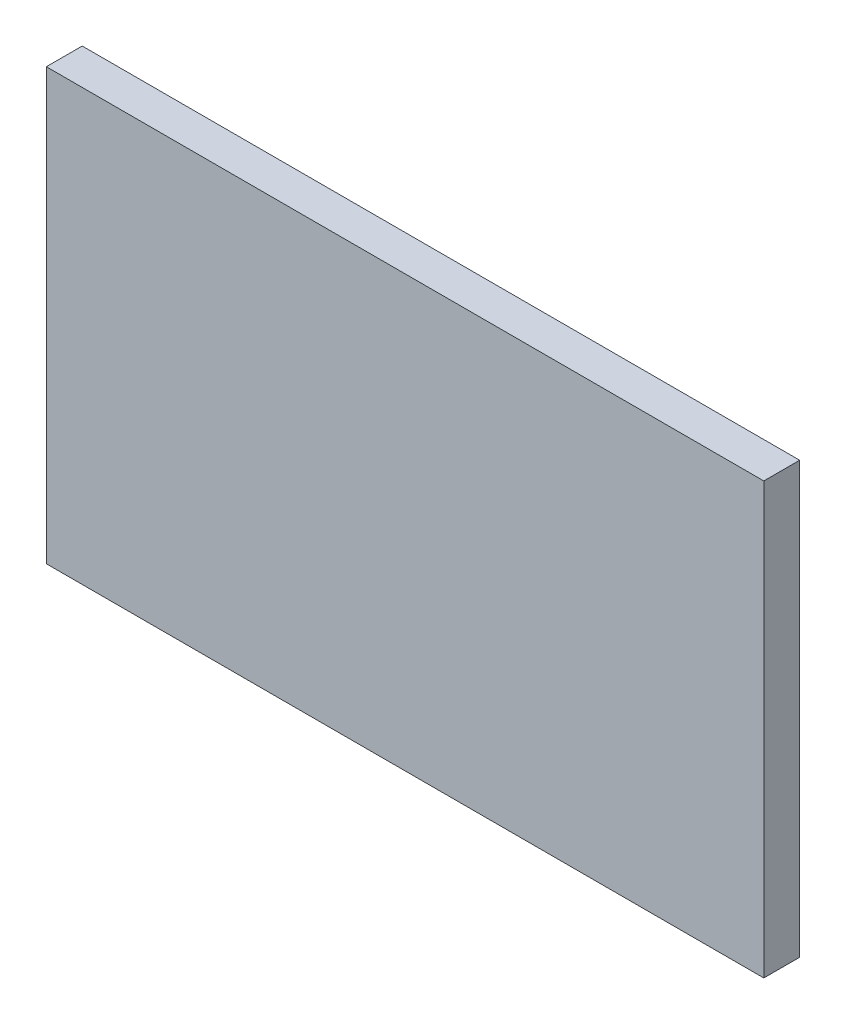
ISO-10303-21;
HEADER;
FILE_DESCRIPTION(('STEP AP214'),'2;1');
FILE_NAME('part.step','',(''),(''),'','','');
FILE_SCHEMA(('AUTOMOTIVE_DESIGN { 1 0 10303 214 1 1 1 1 }'));
ENDSEC;
DATA;
#1=APPLICATION_CONTEXT('core data for automotive mechanical design processes');
#2=APPLICATION_PROTOCOL_DEFINITION('international standard','automotive_design',2000,#1);
#3=PRODUCT_CONTEXT('',#1,'mechanical');
#4=PRODUCT('Part','Part','',(#3));
#5=PRODUCT_RELATED_PRODUCT_CATEGORY('part','',(#4));
#6=PRODUCT_DEFINITION_FORMATION('','',#4);
#7=PRODUCT_DEFINITION_CONTEXT('part definition',#1,'design');
#8=PRODUCT_DEFINITION('design','',#6,#7);
#9=PRODUCT_DEFINITION_SHAPE('','',#8);
#10=(LENGTH_UNIT() NAMED_UNIT(*) SI_UNIT(.MILLI.,.METRE.));
#11=(NAMED_UNIT(*) PLANE_ANGLE_UNIT() SI_UNIT($,.RADIAN.));
#12=(NAMED_UNIT(*) SI_UNIT($,.STERADIAN.) SOLID_ANGLE_UNIT());
#13=UNCERTAINTY_MEASURE_WITH_UNIT(LENGTH_MEASURE(1.E-05),#10,'distance_accuracy_value','');
#14=(GEOMETRIC_REPRESENTATION_CONTEXT(3) GLOBAL_UNCERTAINTY_ASSIGNED_CONTEXT((#13)) GLOBAL_UNIT_ASSIGNED_CONTEXT((#10,
#11,#12)) REPRESENTATION_CONTEXT('',''));
#15=CARTESIAN_POINT('',(0.,0.,0.));
#16=DIRECTION('',(0.,0.,1.));
#17=DIRECTION('',(1.,0.,0.));
#18=AXIS2_PLACEMENT_3D('',#15,#16,#17);
#19=CARTESIAN_POINT('',(-7.5,9.,-0.25));
#20=DIRECTION('',(1.,0.,0.));
#21=DIRECTION('',(0.,0.,-1.));
#22=AXIS2_PLACEMENT_3D('',#19,#20,#21);
#23=PLANE('',#22);
#24=DIRECTION('',(0.,0.,1.));
#25=VECTOR('',#24,1.);
#26=CARTESIAN_POINT('',(-7.5,0.,-0.25));
#27=LINE('',#26,#25);
#28=CARTESIAN_POINT('',(-7.5,0.,-0.25));
#29=VERTEX_POINT('',#28);
#30=CARTESIAN_POINT('',(-7.5,0.,0.5));
#31=VERTEX_POINT('',#30);
#32=EDGE_CURVE('E103',#29,#31,#27,.T.);
#33=ORIENTED_EDGE('',*,*,#32,.T.);
#34=DIRECTION('',(0.,-1.,0.));
#35=VECTOR('',#34,1.);
#36=CARTESIAN_POINT('',(-7.5,9.,0.5));
#37=LINE('',#36,#35);
#38=CARTESIAN_POINT('',(-7.5,9.,0.5));
#39=VERTEX_POINT('',#38);
#40=EDGE_CURVE('E11',#39,#31,#37,.T.);
#41=ORIENTED_EDGE('',*,*,#40,.F.);
#42=DIRECTION('',(0.,0.,1.));
#43=VECTOR('',#42,1.);
#44=CARTESIAN_POINT('',(-7.5,9.,-0.25));
#45=LINE('',#44,#43);
#46=CARTESIAN_POINT('',(-7.5,9.,-0.25));
#47=VERTEX_POINT('',#46);
#48=EDGE_CURVE('E91',#47,#39,#45,.T.);
#49=ORIENTED_EDGE('',*,*,#48,.F.);
#50=DIRECTION('',(0.,-1.,0.));
#51=VECTOR('',#50,1.);
#52=CARTESIAN_POINT('',(-7.5,9.,-0.25));
#53=LINE('',#52,#51);
#54=EDGE_CURVE('E99',#47,#29,#53,.T.);
#55=ORIENTED_EDGE('',*,*,#54,.T.);
#56=EDGE_LOOP('',(#33,#41,#49,#55));
#57=FACE_BOUND('',#56,.T.);
#58=ADVANCED_FACE('F40',(#57),#23,.F.);
#59=CARTESIAN_POINT('',(-7.5,9.,0.5));
#60=DIRECTION('',(0.,0.,-1.));
#61=DIRECTION('',(-1.,0.,0.));
#62=AXIS2_PLACEMENT_3D('',#59,#60,#61);
#63=PLANE('',#62);
#64=DIRECTION('',(1.,0.,0.));
#65=VECTOR('',#64,1.);
#66=CARTESIAN_POINT('',(-7.5,0.,0.5));
#67=LINE('',#66,#65);
#68=CARTESIAN_POINT('',(7.5,0.,0.5));
#69=VERTEX_POINT('',#68);
#70=EDGE_CURVE('E95',#31,#69,#67,.T.);
#71=ORIENTED_EDGE('',*,*,#70,.T.);
#72=DIRECTION('',(0.,-1.,0.));
#73=VECTOR('',#72,1.);
#74=CARTESIAN_POINT('',(7.5,9.,0.5));
#75=LINE('',#74,#73);
#76=CARTESIAN_POINT('',(7.5,9.,0.5));
#77=VERTEX_POINT('',#76);
#78=EDGE_CURVE('E48',#77,#69,#75,.T.);
#79=ORIENTED_EDGE('',*,*,#78,.F.);
#80=DIRECTION('',(1.,0.,0.));
#81=VECTOR('',#80,1.);
#82=CARTESIAN_POINT('',(-7.5,9.,0.5));
#83=LINE('',#82,#81);
#84=EDGE_CURVE('E86',#39,#77,#83,.T.);
#85=ORIENTED_EDGE('',*,*,#84,.F.);
#86=ORIENTED_EDGE('',*,*,#40,.T.);
#87=EDGE_LOOP('',(#71,#79,#85,#86));
#88=FACE_BOUND('',#87,.T.);
#89=ADVANCED_FACE('F94',(#88),#63,.F.);
#90=CARTESIAN_POINT('',(7.5,9.,-0.25));
#91=DIRECTION('',(-1.,0.,0.));
#92=DIRECTION('',(0.,0.,1.));
#93=AXIS2_PLACEMENT_3D('',#90,#91,#92);
#94=PLANE('',#93);
#95=DIRECTION('',(0.,0.,-1.));
#96=VECTOR('',#95,1.);
#97=CARTESIAN_POINT('',(7.5,0.,-0.25));
#98=LINE('',#97,#96);
#99=CARTESIAN_POINT('',(7.5,0.,-0.25));
#100=VERTEX_POINT('',#99);
#101=EDGE_CURVE('E73',#69,#100,#98,.T.);
#102=ORIENTED_EDGE('',*,*,#101,.T.);
#103=DIRECTION('',(0.,-1.,0.));
#104=VECTOR('',#103,1.);
#105=CARTESIAN_POINT('',(7.5,9.,-0.25));
#106=LINE('',#105,#104);
#107=CARTESIAN_POINT('',(7.5,9.,-0.25));
#108=VERTEX_POINT('',#107);
#109=EDGE_CURVE('E96',#108,#100,#106,.T.);
#110=ORIENTED_EDGE('',*,*,#109,.F.);
#111=DIRECTION('',(0.,0.,-1.));
#112=VECTOR('',#111,1.);
#113=CARTESIAN_POINT('',(7.5,9.,-0.25));
#114=LINE('',#113,#112);
#115=EDGE_CURVE('E89',#77,#108,#114,.T.);
#116=ORIENTED_EDGE('',*,*,#115,.F.);
#117=ORIENTED_EDGE('',*,*,#78,.T.);
#118=EDGE_LOOP('',(#102,#110,#116,#117));
#119=FACE_BOUND('',#118,.T.);
#120=ADVANCED_FACE('F97',(#119),#94,.F.);
#121=CARTESIAN_POINT('',(-7.5,9.,-0.25));
#122=DIRECTION('',(0.,0.,1.));
#123=DIRECTION('',(1.,0.,0.));
#124=AXIS2_PLACEMENT_3D('',#121,#122,#123);
#125=PLANE('',#124);
#126=DIRECTION('',(-1.,0.,0.));
#127=VECTOR('',#126,1.);
#128=CARTESIAN_POINT('',(-7.5,0.,-0.25));
#129=LINE('',#128,#127);
#130=EDGE_CURVE('E79',#100,#29,#129,.T.);
#131=ORIENTED_EDGE('',*,*,#130,.T.);
#132=ORIENTED_EDGE('',*,*,#54,.F.);
#133=DIRECTION('',(-1.,0.,0.));
#134=VECTOR('',#133,1.);
#135=CARTESIAN_POINT('',(-7.5,9.,-0.25));
#136=LINE('',#135,#134);
#137=EDGE_CURVE('E56',#108,#47,#136,.T.);
#138=ORIENTED_EDGE('',*,*,#137,.F.);
#139=ORIENTED_EDGE('',*,*,#109,.T.);
#140=EDGE_LOOP('',(#131,#132,#138,#139));
#141=FACE_BOUND('',#140,.T.);
#142=ADVANCED_FACE('F110',(#141),#125,.F.);
#143=CARTESIAN_POINT('',(0.,9.,0.));
#144=DIRECTION('',(0.,1.,0.));
#145=DIRECTION('',(0.,0.,1.));
#146=AXIS2_PLACEMENT_3D('',#143,#144,#145);
#147=PLANE('',#146);
#148=ORIENTED_EDGE('',*,*,#48,.T.);
#149=ORIENTED_EDGE('',*,*,#84,.T.);
#150=ORIENTED_EDGE('',*,*,#115,.T.);
#151=ORIENTED_EDGE('',*,*,#137,.T.);
#152=EDGE_LOOP('',(#148,#149,#150,#151));
#153=FACE_BOUND('',#152,.T.);
#154=ADVANCED_FACE('F87',(#153),#147,.T.);
#155=CARTESIAN_POINT('',(0.,0.,0.));
#156=DIRECTION('',(0.,1.,0.));
#157=DIRECTION('',(0.,0.,1.));
#158=AXIS2_PLACEMENT_3D('',#155,#156,#157);
#159=PLANE('',#158);
#160=ORIENTED_EDGE('',*,*,#32,.F.);
#161=ORIENTED_EDGE('',*,*,#130,.F.);
#162=ORIENTED_EDGE('',*,*,#101,.F.);
#163=ORIENTED_EDGE('',*,*,#70,.F.);
#164=EDGE_LOOP('',(#160,#161,#162,#163));
#165=FACE_BOUND('',#164,.T.);
#166=ADVANCED_FACE('F113',(#165),#159,.F.);
#167=CLOSED_SHELL('',(#58,#89,#120,#142,#154,#166));
#168=MANIFOLD_SOLID_BREP('B2',#167);
#169=ADVANCED_BREP_SHAPE_REPRESENTATION('',(#18,#168),#14);
#170=SHAPE_DEFINITION_REPRESENTATION(#9,#169);
ENDSEC;
END-ISO-10303-21;
